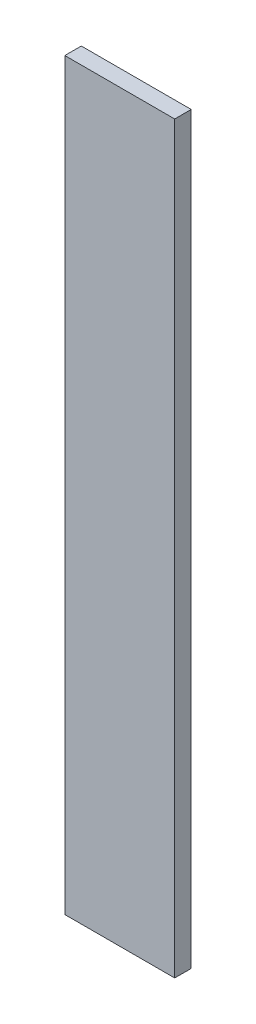
ISO-10303-21;
HEADER;
FILE_DESCRIPTION(('STEP AP214'),'2;1');
FILE_NAME('part.step','',(''),(''),'','','');
FILE_SCHEMA(('AUTOMOTIVE_DESIGN { 1 0 10303 214 1 1 1 1 }'));
ENDSEC;
DATA;
#1=APPLICATION_CONTEXT('core data for automotive mechanical design processes');
#2=APPLICATION_PROTOCOL_DEFINITION('international standard','automotive_design',2000,#1);
#3=PRODUCT_CONTEXT('',#1,'mechanical');
#4=PRODUCT('Part','Part','',(#3));
#5=PRODUCT_RELATED_PRODUCT_CATEGORY('part','',(#4));
#6=PRODUCT_DEFINITION_FORMATION('','',#4);
#7=PRODUCT_DEFINITION_CONTEXT('part definition',#1,'design');
#8=PRODUCT_DEFINITION('design','',#6,#7);
#9=PRODUCT_DEFINITION_SHAPE('','',#8);
#10=(LENGTH_UNIT() NAMED_UNIT(*) SI_UNIT(.MILLI.,.METRE.));
#11=(NAMED_UNIT(*) PLANE_ANGLE_UNIT() SI_UNIT($,.RADIAN.));
#12=(NAMED_UNIT(*) SI_UNIT($,.STERADIAN.) SOLID_ANGLE_UNIT());
#13=UNCERTAINTY_MEASURE_WITH_UNIT(LENGTH_MEASURE(1.E-05),#10,'distance_accuracy_value','');
#14=(GEOMETRIC_REPRESENTATION_CONTEXT(3) GLOBAL_UNCERTAINTY_ASSIGNED_CONTEXT((#13)) GLOBAL_UNIT_ASSIGNED_CONTEXT((#10,
#11,#12)) REPRESENTATION_CONTEXT('',''));
#15=CARTESIAN_POINT('',(0.,0.,0.));
#16=DIRECTION('',(0.,0.,1.));
#17=DIRECTION('',(1.,0.,0.));
#18=AXIS2_PLACEMENT_3D('',#15,#16,#17);
#19=CARTESIAN_POINT('',(0.,0.,150.));
#20=DIRECTION('',(1.,0.,0.));
#21=DIRECTION('',(0.,0.,-1.));
#22=AXIS2_PLACEMENT_3D('',#19,#20,#21);
#23=PLANE('',#22);
#24=DIRECTION('',(0.,-1.,0.));
#25=VECTOR('',#24,1.);
#26=CARTESIAN_POINT('',(0.,0.,0.));
#27=LINE('',#26,#25);
#28=CARTESIAN_POINT('',(0.,0.,0.));
#29=VERTEX_POINT('',#28);
#30=CARTESIAN_POINT('',(0.,-6770.,0.));
#31=VERTEX_POINT('',#30);
#32=EDGE_CURVE('E107',#29,#31,#27,.T.);
#33=ORIENTED_EDGE('',*,*,#32,.T.);
#34=DIRECTION('',(0.,0.,-1.));
#35=VECTOR('',#34,1.);
#36=CARTESIAN_POINT('',(0.,-6770.,150.));
#37=LINE('',#36,#35);
#38=CARTESIAN_POINT('',(0.,-6770.,150.));
#39=VERTEX_POINT('',#38);
#40=EDGE_CURVE('E11',#39,#31,#37,.T.);
#41=ORIENTED_EDGE('',*,*,#40,.F.);
#42=DIRECTION('',(0.,-1.,0.));
#43=VECTOR('',#42,1.);
#44=CARTESIAN_POINT('',(0.,0.,150.));
#45=LINE('',#44,#43);
#46=CARTESIAN_POINT('',(0.,0.,150.));
#47=VERTEX_POINT('',#46);
#48=EDGE_CURVE('E91',#47,#39,#45,.T.);
#49=ORIENTED_EDGE('',*,*,#48,.F.);
#50=DIRECTION('',(0.,0.,-1.));
#51=VECTOR('',#50,1.);
#52=CARTESIAN_POINT('',(0.,0.,150.));
#53=LINE('',#52,#51);
#54=EDGE_CURVE('E103',#47,#29,#53,.T.);
#55=ORIENTED_EDGE('',*,*,#54,.T.);
#56=EDGE_LOOP('',(#33,#41,#49,#55));
#57=FACE_BOUND('',#56,.T.);
#58=ADVANCED_FACE('F39',(#57),#23,.F.);
#59=CARTESIAN_POINT('',(0.,-6770.,150.));
#60=DIRECTION('',(0.,1.,0.));
#61=DIRECTION('',(0.,0.,1.));
#62=AXIS2_PLACEMENT_3D('',#59,#60,#61);
#63=PLANE('',#62);
#64=DIRECTION('',(1.,0.,0.));
#65=VECTOR('',#64,1.);
#66=CARTESIAN_POINT('',(0.,-6770.,0.));
#67=LINE('',#66,#65);
#68=CARTESIAN_POINT('',(1000.,-6770.,0.));
#69=VERTEX_POINT('',#68);
#70=EDGE_CURVE('E96',#31,#69,#67,.T.);
#71=ORIENTED_EDGE('',*,*,#70,.T.);
#72=DIRECTION('',(0.,0.,-1.));
#73=VECTOR('',#72,1.);
#74=CARTESIAN_POINT('',(1000.,-6770.,150.));
#75=LINE('',#74,#73);
#76=CARTESIAN_POINT('',(1000.,-6770.,150.));
#77=VERTEX_POINT('',#76);
#78=EDGE_CURVE('E48',#77,#69,#75,.T.);
#79=ORIENTED_EDGE('',*,*,#78,.F.);
#80=DIRECTION('',(1.,0.,0.));
#81=VECTOR('',#80,1.);
#82=CARTESIAN_POINT('',(0.,-6770.,150.));
#83=LINE('',#82,#81);
#84=EDGE_CURVE('E86',#39,#77,#83,.T.);
#85=ORIENTED_EDGE('',*,*,#84,.F.);
#86=ORIENTED_EDGE('',*,*,#40,.T.);
#87=EDGE_LOOP('',(#71,#79,#85,#86));
#88=FACE_BOUND('',#87,.T.);
#89=ADVANCED_FACE('F95',(#88),#63,.F.);
#90=CARTESIAN_POINT('',(1000.,0.,150.));
#91=DIRECTION('',(-1.,0.,0.));
#92=DIRECTION('',(0.,0.,1.));
#93=AXIS2_PLACEMENT_3D('',#90,#91,#92);
#94=PLANE('',#93);
#95=DIRECTION('',(0.,1.,0.));
#96=VECTOR('',#95,1.);
#97=CARTESIAN_POINT('',(1000.,0.,0.));
#98=LINE('',#97,#96);
#99=CARTESIAN_POINT('',(1000.,0.,0.));
#100=VERTEX_POINT('',#99);
#101=EDGE_CURVE('E73',#69,#100,#98,.T.);
#102=ORIENTED_EDGE('',*,*,#101,.T.);
#103=DIRECTION('',(0.,0.,-1.));
#104=VECTOR('',#103,1.);
#105=CARTESIAN_POINT('',(1000.,0.,150.));
#106=LINE('',#105,#104);
#107=CARTESIAN_POINT('',(1000.,0.,150.));
#108=VERTEX_POINT('',#107);
#109=EDGE_CURVE('E98',#108,#100,#106,.T.);
#110=ORIENTED_EDGE('',*,*,#109,.F.);
#111=DIRECTION('',(0.,1.,0.));
#112=VECTOR('',#111,1.);
#113=CARTESIAN_POINT('',(1000.,0.,150.));
#114=LINE('',#113,#112);
#115=EDGE_CURVE('E89',#77,#108,#114,.T.);
#116=ORIENTED_EDGE('',*,*,#115,.F.);
#117=ORIENTED_EDGE('',*,*,#78,.T.);
#118=EDGE_LOOP('',(#102,#110,#116,#117));
#119=FACE_BOUND('',#118,.T.);
#120=ADVANCED_FACE('F99',(#119),#94,.F.);
#121=CARTESIAN_POINT('',(0.,0.,150.));
#122=DIRECTION('',(0.,-1.,0.));
#123=DIRECTION('',(0.,0.,-1.));
#124=AXIS2_PLACEMENT_3D('',#121,#122,#123);
#125=PLANE('',#124);
#126=DIRECTION('',(-1.,0.,0.));
#127=VECTOR('',#126,1.);
#128=CARTESIAN_POINT('',(0.,0.,0.));
#129=LINE('',#128,#127);
#130=EDGE_CURVE('E79',#100,#29,#129,.T.);
#131=ORIENTED_EDGE('',*,*,#130,.T.);
#132=ORIENTED_EDGE('',*,*,#54,.F.);
#133=DIRECTION('',(-1.,0.,0.));
#134=VECTOR('',#133,1.);
#135=CARTESIAN_POINT('',(0.,0.,150.));
#136=LINE('',#135,#134);
#137=EDGE_CURVE('E56',#108,#47,#136,.T.);
#138=ORIENTED_EDGE('',*,*,#137,.F.);
#139=ORIENTED_EDGE('',*,*,#109,.T.);
#140=EDGE_LOOP('',(#131,#132,#138,#139));
#141=FACE_BOUND('',#140,.T.);
#142=ADVANCED_FACE('F120',(#141),#125,.F.);
#143=CARTESIAN_POINT('',(0.,0.,150.));
#144=DIRECTION('',(0.,0.,1.));
#145=DIRECTION('',(1.,0.,0.));
#146=AXIS2_PLACEMENT_3D('',#143,#144,#145);
#147=PLANE('',#146);
#148=ORIENTED_EDGE('',*,*,#48,.T.);
#149=ORIENTED_EDGE('',*,*,#84,.T.);
#150=ORIENTED_EDGE('',*,*,#115,.T.);
#151=ORIENTED_EDGE('',*,*,#137,.T.);
#152=EDGE_LOOP('',(#148,#149,#150,#151));
#153=FACE_BOUND('',#152,.T.);
#154=ADVANCED_FACE('F87',(#153),#147,.T.);
#155=CARTESIAN_POINT('',(0.,0.,0.));
#156=DIRECTION('',(0.,0.,1.));
#157=DIRECTION('',(1.,0.,0.));
#158=AXIS2_PLACEMENT_3D('',#155,#156,#157);
#159=PLANE('',#158);
#160=ORIENTED_EDGE('',*,*,#32,.F.);
#161=ORIENTED_EDGE('',*,*,#130,.F.);
#162=ORIENTED_EDGE('',*,*,#101,.F.);
#163=ORIENTED_EDGE('',*,*,#70,.F.);
#164=EDGE_LOOP('',(#160,#161,#162,#163));
#165=FACE_BOUND('',#164,.T.);
#166=ADVANCED_FACE('F123',(#165),#159,.F.);
#167=CLOSED_SHELL('',(#58,#89,#120,#142,#154,#166));
#168=MANIFOLD_SOLID_BREP('B2',#167);
#169=ADVANCED_BREP_SHAPE_REPRESENTATION('',(#18,#168),#14);
#170=SHAPE_DEFINITION_REPRESENTATION(#9,#169);
ENDSEC;
END-ISO-10303-21;
